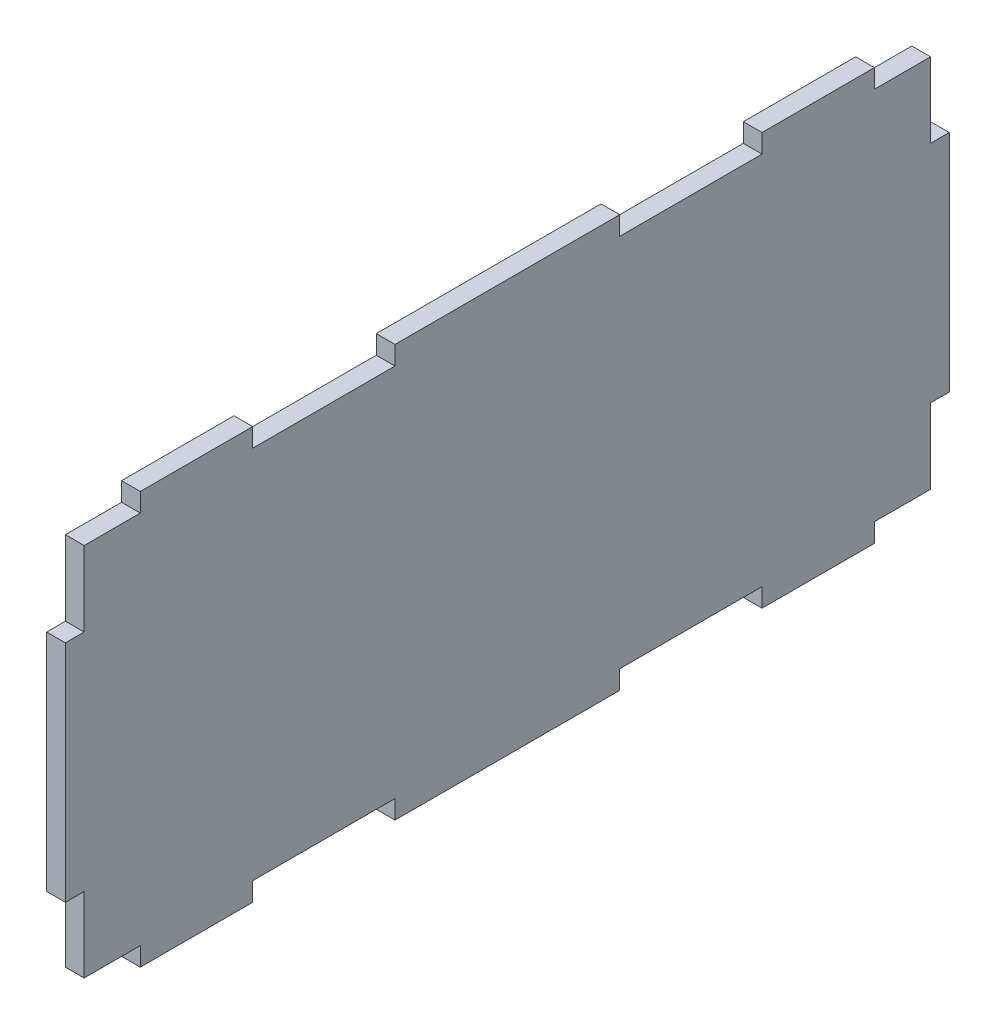
ISO-10303-21;
HEADER;
FILE_DESCRIPTION(('STEP AP214'),'2;1');
FILE_NAME('part.step','',(''),(''),'','','');
FILE_SCHEMA(('AUTOMOTIVE_DESIGN { 1 0 10303 214 1 1 1 1 }'));
ENDSEC;
DATA;
#1=APPLICATION_CONTEXT('core data for automotive mechanical design processes');
#2=APPLICATION_PROTOCOL_DEFINITION('international standard','automotive_design',2000,#1);
#3=PRODUCT_CONTEXT('',#1,'mechanical');
#4=PRODUCT('Part','Part','',(#3));
#5=PRODUCT_RELATED_PRODUCT_CATEGORY('part','',(#4));
#6=PRODUCT_DEFINITION_FORMATION('','',#4);
#7=PRODUCT_DEFINITION_CONTEXT('part definition',#1,'design');
#8=PRODUCT_DEFINITION('design','',#6,#7);
#9=PRODUCT_DEFINITION_SHAPE('','',#8);
#10=(LENGTH_UNIT() NAMED_UNIT(*) SI_UNIT(.MILLI.,.METRE.));
#11=(NAMED_UNIT(*) PLANE_ANGLE_UNIT() SI_UNIT($,.RADIAN.));
#12=(NAMED_UNIT(*) SI_UNIT($,.STERADIAN.) SOLID_ANGLE_UNIT());
#13=UNCERTAINTY_MEASURE_WITH_UNIT(LENGTH_MEASURE(1.E-05),#10,'distance_accuracy_value','');
#14=(GEOMETRIC_REPRESENTATION_CONTEXT(3) GLOBAL_UNCERTAINTY_ASSIGNED_CONTEXT((#13)) GLOBAL_UNIT_ASSIGNED_CONTEXT((#10,
#11,#12)) REPRESENTATION_CONTEXT('',''));
#15=CARTESIAN_POINT('',(0.,0.,0.));
#16=DIRECTION('',(0.,0.,1.));
#17=DIRECTION('',(1.,0.,0.));
#18=AXIS2_PLACEMENT_3D('',#15,#16,#17);
#19=CARTESIAN_POINT('',(5.,-50.,0.));
#20=DIRECTION('',(0.,-1.,0.));
#21=DIRECTION('',(0.,0.,-1.));
#22=AXIS2_PLACEMENT_3D('',#19,#20,#21);
#23=PLANE('',#22);
#24=DIRECTION('',(0.,0.,1.));
#25=VECTOR('',#24,1.);
#26=CARTESIAN_POINT('',(0.,-50.,0.));
#27=LINE('',#26,#25);
#28=CARTESIAN_POINT('',(0.,-50.,98.));
#29=VERTEX_POINT('',#28);
#30=CARTESIAN_POINT('',(0.,-50.,113.));
#31=VERTEX_POINT('',#30);
#32=EDGE_CURVE('E742',#29,#31,#27,.T.);
#33=ORIENTED_EDGE('',*,*,#32,.F.);
#34=DIRECTION('',(-1.,0.,0.));
#35=VECTOR('',#34,1.);
#36=CARTESIAN_POINT('',(5.,-50.,98.));
#37=LINE('',#36,#35);
#38=CARTESIAN_POINT('',(5.,-50.,98.));
#39=VERTEX_POINT('',#38);
#40=EDGE_CURVE('E582',#39,#29,#37,.T.);
#41=ORIENTED_EDGE('',*,*,#40,.F.);
#42=DIRECTION('',(0.,0.,1.));
#43=VECTOR('',#42,1.);
#44=CARTESIAN_POINT('',(5.,-50.,0.));
#45=LINE('',#44,#43);
#46=CARTESIAN_POINT('',(5.,-50.,113.));
#47=VERTEX_POINT('',#46);
#48=EDGE_CURVE('E585',#39,#47,#45,.T.);
#49=ORIENTED_EDGE('',*,*,#48,.T.);
#50=DIRECTION('',(-1.,0.,0.));
#51=VECTOR('',#50,1.);
#52=CARTESIAN_POINT('',(5.,-50.,113.));
#53=LINE('',#52,#51);
#54=EDGE_CURVE('E573',#47,#31,#53,.T.);
#55=ORIENTED_EDGE('',*,*,#54,.T.);
#56=EDGE_LOOP('',(#33,#41,#49,#55));
#57=FACE_BOUND('',#56,.T.);
#58=ADVANCED_FACE('F252',(#57),#23,.T.);
#59=CARTESIAN_POINT('',(5.,0.,98.));
#60=DIRECTION('',(0.,0.,-1.));
#61=DIRECTION('',(-1.,0.,0.));
#62=AXIS2_PLACEMENT_3D('',#59,#60,#61);
#63=PLANE('',#62);
#64=DIRECTION('',(0.,-1.,0.));
#65=VECTOR('',#64,1.);
#66=CARTESIAN_POINT('',(0.,0.,98.));
#67=LINE('',#66,#65);
#68=CARTESIAN_POINT('',(0.,-55.,98.));
#69=VERTEX_POINT('',#68);
#70=EDGE_CURVE('E740',#29,#69,#67,.T.);
#71=ORIENTED_EDGE('',*,*,#70,.T.);
#72=DIRECTION('',(-1.,0.,0.));
#73=VECTOR('',#72,1.);
#74=CARTESIAN_POINT('',(5.,-55.,98.));
#75=LINE('',#74,#73);
#76=CARTESIAN_POINT('',(5.,-55.,98.));
#77=VERTEX_POINT('',#76);
#78=EDGE_CURVE('E657',#77,#69,#75,.T.);
#79=ORIENTED_EDGE('',*,*,#78,.F.);
#80=DIRECTION('',(0.,-1.,0.));
#81=VECTOR('',#80,1.);
#82=CARTESIAN_POINT('',(5.,0.,98.));
#83=LINE('',#82,#81);
#84=EDGE_CURVE('E593',#39,#77,#83,.T.);
#85=ORIENTED_EDGE('',*,*,#84,.F.);
#86=ORIENTED_EDGE('',*,*,#40,.T.);
#87=EDGE_LOOP('',(#71,#79,#85,#86));
#88=FACE_BOUND('',#87,.T.);
#89=ADVANCED_FACE('F796',(#88),#63,.F.);
#90=CARTESIAN_POINT('',(5.,-55.0000000000002,1.1449174941447E-13));
#91=DIRECTION('',(0.,1.,0.));
#92=DIRECTION('',(0.,0.,1.));
#93=AXIS2_PLACEMENT_3D('',#90,#91,#92);
#94=PLANE('',#93);
#95=DIRECTION('',(0.,0.,-1.));
#96=VECTOR('',#95,1.);
#97=CARTESIAN_POINT('',(0.,-55.0000000000002,1.1449174941447E-13));
#98=LINE('',#97,#96);
#99=CARTESIAN_POINT('',(0.,-55.,68.));
#100=VERTEX_POINT('',#99);
#101=EDGE_CURVE('E737',#69,#100,#98,.T.);
#102=ORIENTED_EDGE('',*,*,#101,.T.);
#103=DIRECTION('',(-1.,0.,0.));
#104=VECTOR('',#103,1.);
#105=CARTESIAN_POINT('',(5.,-55.,68.));
#106=LINE('',#105,#104);
#107=CARTESIAN_POINT('',(5.,-55.,68.));
#108=VERTEX_POINT('',#107);
#109=EDGE_CURVE('E660',#108,#100,#106,.T.);
#110=ORIENTED_EDGE('',*,*,#109,.F.);
#111=DIRECTION('',(0.,0.,-1.));
#112=VECTOR('',#111,1.);
#113=CARTESIAN_POINT('',(5.,-55.0000000000002,1.1449174941447E-13));
#114=LINE('',#113,#112);
#115=EDGE_CURVE('E597',#77,#108,#114,.T.);
#116=ORIENTED_EDGE('',*,*,#115,.F.);
#117=ORIENTED_EDGE('',*,*,#78,.T.);
#118=EDGE_LOOP('',(#102,#110,#116,#117));
#119=FACE_BOUND('',#118,.T.);
#120=ADVANCED_FACE('F779',(#119),#94,.F.);
#121=CARTESIAN_POINT('',(5.,0.,68.));
#122=DIRECTION('',(0.,0.,-1.));
#123=DIRECTION('',(-1.,0.,0.));
#124=AXIS2_PLACEMENT_3D('',#121,#122,#123);
#125=PLANE('',#124);
#126=DIRECTION('',(0.,-1.,0.));
#127=VECTOR('',#126,1.);
#128=CARTESIAN_POINT('',(0.,0.,68.));
#129=LINE('',#128,#127);
#130=CARTESIAN_POINT('',(0.,-50.,68.));
#131=VERTEX_POINT('',#130);
#132=EDGE_CURVE('E733',#131,#100,#129,.T.);
#133=ORIENTED_EDGE('',*,*,#132,.F.);
#134=DIRECTION('',(-1.,0.,0.));
#135=VECTOR('',#134,1.);
#136=CARTESIAN_POINT('',(5.,-50.,68.));
#137=LINE('',#136,#135);
#138=CARTESIAN_POINT('',(5.,-50.,68.));
#139=VERTEX_POINT('',#138);
#140=EDGE_CURVE('E662',#139,#131,#137,.T.);
#141=ORIENTED_EDGE('',*,*,#140,.F.);
#142=DIRECTION('',(0.,-1.,0.));
#143=VECTOR('',#142,1.);
#144=CARTESIAN_POINT('',(5.,0.,68.));
#145=LINE('',#144,#143);
#146=EDGE_CURVE('E600',#139,#108,#145,.T.);
#147=ORIENTED_EDGE('',*,*,#146,.T.);
#148=ORIENTED_EDGE('',*,*,#109,.T.);
#149=EDGE_LOOP('',(#133,#141,#147,#148));
#150=FACE_BOUND('',#149,.T.);
#151=ADVANCED_FACE('F784',(#150),#125,.T.);
#152=DIRECTION('',(-1.,0.,0.));
#153=VECTOR('',#152,1.);
#154=CARTESIAN_POINT('',(5.,-49.9999999999999,30.));
#155=LINE('',#154,#153);
#156=CARTESIAN_POINT('',(5.,-50.,30.));
#157=VERTEX_POINT('',#156);
#158=CARTESIAN_POINT('',(0.,-50.,30.));
#159=VERTEX_POINT('',#158);
#160=EDGE_CURVE('E360',#157,#159,#155,.T.);
#161=ORIENTED_EDGE('',*,*,#160,.F.);
#162=EDGE_CURVE('E595',#157,#139,#45,.T.);
#163=ORIENTED_EDGE('',*,*,#162,.T.);
#164=ORIENTED_EDGE('',*,*,#140,.T.);
#165=EDGE_CURVE('E736',#159,#131,#27,.T.);
#166=ORIENTED_EDGE('',*,*,#165,.F.);
#167=EDGE_LOOP('',(#161,#163,#164,#166));
#168=FACE_BOUND('',#167,.T.);
#169=ADVANCED_FACE('F787',(#168),#23,.T.);
#170=CARTESIAN_POINT('',(5.,-50.,-68.));
#171=VERTEX_POINT('',#170);
#172=CARTESIAN_POINT('',(5.,-50.,-30.));
#173=VERTEX_POINT('',#172);
#174=EDGE_CURVE('E599',#171,#173,#45,.T.);
#175=ORIENTED_EDGE('',*,*,#174,.T.);
#176=DIRECTION('',(-1.,0.,0.));
#177=VECTOR('',#176,1.);
#178=CARTESIAN_POINT('',(5.,-49.9999999999999,-30.));
#179=LINE('',#178,#177);
#180=CARTESIAN_POINT('',(0.,-50.,-30.));
#181=VERTEX_POINT('',#180);
#182=EDGE_CURVE('E367',#173,#181,#179,.T.);
#183=ORIENTED_EDGE('',*,*,#182,.T.);
#184=CARTESIAN_POINT('',(0.,-50.,-68.));
#185=VERTEX_POINT('',#184);
#186=EDGE_CURVE('E792',#185,#181,#27,.T.);
#187=ORIENTED_EDGE('',*,*,#186,.F.);
#188=DIRECTION('',(1.,0.,0.));
#189=VECTOR('',#188,1.);
#190=CARTESIAN_POINT('',(5.,-50.,-68.));
#191=LINE('',#190,#189);
#192=EDGE_CURVE('E408',#185,#171,#191,.T.);
#193=ORIENTED_EDGE('',*,*,#192,.T.);
#194=EDGE_LOOP('',(#175,#183,#187,#193));
#195=FACE_BOUND('',#194,.T.);
#196=ADVANCED_FACE('F608',(#195),#23,.T.);
#197=CARTESIAN_POINT('',(5.,-50.,-113.));
#198=VERTEX_POINT('',#197);
#199=CARTESIAN_POINT('',(5.,-50.,-98.));
#200=VERTEX_POINT('',#199);
#201=EDGE_CURVE('E596',#198,#200,#45,.T.);
#202=ORIENTED_EDGE('',*,*,#201,.T.);
#203=DIRECTION('',(-1.,0.,0.));
#204=VECTOR('',#203,1.);
#205=CARTESIAN_POINT('',(5.,-49.9999999999999,-98.));
#206=LINE('',#205,#204);
#207=CARTESIAN_POINT('',(0.,-50.,-98.));
#208=VERTEX_POINT('',#207);
#209=EDGE_CURVE('E376',#200,#208,#206,.T.);
#210=ORIENTED_EDGE('',*,*,#209,.T.);
#211=CARTESIAN_POINT('',(0.,-50.,-113.));
#212=VERTEX_POINT('',#211);
#213=EDGE_CURVE('E744',#212,#208,#27,.T.);
#214=ORIENTED_EDGE('',*,*,#213,.F.);
#215=DIRECTION('',(-1.,0.,0.));
#216=VECTOR('',#215,1.);
#217=CARTESIAN_POINT('',(5.,-50.,-113.));
#218=LINE('',#217,#216);
#219=EDGE_CURVE('E665',#198,#212,#218,.T.);
#220=ORIENTED_EDGE('',*,*,#219,.F.);
#221=EDGE_LOOP('',(#202,#210,#214,#220));
#222=FACE_BOUND('',#221,.T.);
#223=ADVANCED_FACE('F938',(#222),#23,.T.);
#224=CARTESIAN_POINT('',(5.,0.,-113.));
#225=DIRECTION('',(0.,0.,1.));
#226=DIRECTION('',(1.,0.,0.));
#227=AXIS2_PLACEMENT_3D('',#224,#225,#226);
#228=PLANE('',#227);
#229=DIRECTION('',(-1.,0.,0.));
#230=VECTOR('',#229,1.);
#231=CARTESIAN_POINT('',(5.,-30.,-113.));
#232=LINE('',#231,#230);
#233=CARTESIAN_POINT('',(5.,-30.,-113.));
#234=VERTEX_POINT('',#233);
#235=CARTESIAN_POINT('',(0.,-30.,-113.));
#236=VERTEX_POINT('',#235);
#237=EDGE_CURVE('E12',#234,#236,#232,.T.);
#238=ORIENTED_EDGE('',*,*,#237,.F.);
#239=DIRECTION('',(0.,1.,0.));
#240=VECTOR('',#239,1.);
#241=CARTESIAN_POINT('',(5.,0.,-113.));
#242=LINE('',#241,#240);
#243=EDGE_CURVE('E423',#198,#234,#242,.T.);
#244=ORIENTED_EDGE('',*,*,#243,.F.);
#245=ORIENTED_EDGE('',*,*,#219,.T.);
#246=DIRECTION('',(0.,1.,0.));
#247=VECTOR('',#246,1.);
#248=CARTESIAN_POINT('',(0.,0.,-113.));
#249=LINE('',#248,#247);
#250=EDGE_CURVE('E730',#212,#236,#249,.T.);
#251=ORIENTED_EDGE('',*,*,#250,.T.);
#252=EDGE_LOOP('',(#238,#244,#245,#251));
#253=FACE_BOUND('',#252,.T.);
#254=ADVANCED_FACE('F933',(#253),#228,.F.);
#255=CARTESIAN_POINT('',(5.,30.,-113.));
#256=VERTEX_POINT('',#255);
#257=CARTESIAN_POINT('',(5.,50.,-113.));
#258=VERTEX_POINT('',#257);
#259=EDGE_CURVE('E602',#256,#258,#242,.T.);
#260=ORIENTED_EDGE('',*,*,#259,.F.);
#261=DIRECTION('',(-1.,0.,0.));
#262=VECTOR('',#261,1.);
#263=CARTESIAN_POINT('',(5.,30.,-113.));
#264=LINE('',#263,#262);
#265=CARTESIAN_POINT('',(0.,30.,-113.));
#266=VERTEX_POINT('',#265);
#267=EDGE_CURVE('E262',#256,#266,#264,.T.);
#268=ORIENTED_EDGE('',*,*,#267,.T.);
#269=CARTESIAN_POINT('',(0.,50.,-113.));
#270=VERTEX_POINT('',#269);
#271=EDGE_CURVE('E732',#266,#270,#249,.T.);
#272=ORIENTED_EDGE('',*,*,#271,.T.);
#273=DIRECTION('',(-1.,0.,0.));
#274=VECTOR('',#273,1.);
#275=CARTESIAN_POINT('',(5.,50.,-113.));
#276=LINE('',#275,#274);
#277=EDGE_CURVE('E667',#258,#270,#276,.T.);
#278=ORIENTED_EDGE('',*,*,#277,.F.);
#279=EDGE_LOOP('',(#260,#268,#272,#278));
#280=FACE_BOUND('',#279,.T.);
#281=ADVANCED_FACE('F846',(#280),#228,.F.);
#282=CARTESIAN_POINT('',(5.,50.,0.));
#283=DIRECTION('',(0.,-1.,0.));
#284=DIRECTION('',(0.,0.,-1.));
#285=AXIS2_PLACEMENT_3D('',#282,#283,#284);
#286=PLANE('',#285);
#287=DIRECTION('',(0.,0.,1.));
#288=VECTOR('',#287,1.);
#289=CARTESIAN_POINT('',(0.,50.,0.));
#290=LINE('',#289,#288);
#291=CARTESIAN_POINT('',(0.,50.,-98.));
#292=VERTEX_POINT('',#291);
#293=EDGE_CURVE('E728',#270,#292,#290,.T.);
#294=ORIENTED_EDGE('',*,*,#293,.T.);
#295=DIRECTION('',(-1.,0.,0.));
#296=VECTOR('',#295,1.);
#297=CARTESIAN_POINT('',(5.,50.,-98.));
#298=LINE('',#297,#296);
#299=CARTESIAN_POINT('',(5.,50.,-98.));
#300=VERTEX_POINT('',#299);
#301=EDGE_CURVE('E670',#300,#292,#298,.T.);
#302=ORIENTED_EDGE('',*,*,#301,.F.);
#303=DIRECTION('',(0.,0.,1.));
#304=VECTOR('',#303,1.);
#305=CARTESIAN_POINT('',(5.,50.,0.));
#306=LINE('',#305,#304);
#307=EDGE_CURVE('E770',#258,#300,#306,.T.);
#308=ORIENTED_EDGE('',*,*,#307,.F.);
#309=ORIENTED_EDGE('',*,*,#277,.T.);
#310=EDGE_LOOP('',(#294,#302,#308,#309));
#311=FACE_BOUND('',#310,.T.);
#312=ADVANCED_FACE('F849',(#311),#286,.F.);
#313=CARTESIAN_POINT('',(5.,0.,-98.));
#314=DIRECTION('',(0.,0.,1.));
#315=DIRECTION('',(1.,0.,0.));
#316=AXIS2_PLACEMENT_3D('',#313,#314,#315);
#317=PLANE('',#316);
#318=DIRECTION('',(0.,1.,0.));
#319=VECTOR('',#318,1.);
#320=CARTESIAN_POINT('',(0.,0.,-98.));
#321=LINE('',#320,#319);
#322=CARTESIAN_POINT('',(0.,55.,-98.));
#323=VERTEX_POINT('',#322);
#324=EDGE_CURVE('E726',#292,#323,#321,.T.);
#325=ORIENTED_EDGE('',*,*,#324,.T.);
#326=DIRECTION('',(-1.,0.,0.));
#327=VECTOR('',#326,1.);
#328=CARTESIAN_POINT('',(5.,55.,-98.));
#329=LINE('',#328,#327);
#330=CARTESIAN_POINT('',(5.,55.,-98.));
#331=VERTEX_POINT('',#330);
#332=EDGE_CURVE('E673',#331,#323,#329,.T.);
#333=ORIENTED_EDGE('',*,*,#332,.F.);
#334=DIRECTION('',(0.,1.,0.));
#335=VECTOR('',#334,1.);
#336=CARTESIAN_POINT('',(5.,0.,-98.));
#337=LINE('',#336,#335);
#338=EDGE_CURVE('E768',#300,#331,#337,.T.);
#339=ORIENTED_EDGE('',*,*,#338,.F.);
#340=ORIENTED_EDGE('',*,*,#301,.T.);
#341=EDGE_LOOP('',(#325,#333,#339,#340));
#342=FACE_BOUND('',#341,.T.);
#343=ADVANCED_FACE('F857',(#342),#317,.F.);
#344=CARTESIAN_POINT('',(5.,55.0000000000002,0.));
#345=DIRECTION('',(0.,-1.,0.));
#346=DIRECTION('',(0.,0.,-1.));
#347=AXIS2_PLACEMENT_3D('',#344,#345,#346);
#348=PLANE('',#347);
#349=DIRECTION('',(0.,0.,1.));
#350=VECTOR('',#349,1.);
#351=CARTESIAN_POINT('',(0.,55.0000000000002,0.));
#352=LINE('',#351,#350);
#353=CARTESIAN_POINT('',(0.,55.,-68.));
#354=VERTEX_POINT('',#353);
#355=EDGE_CURVE('E723',#323,#354,#352,.T.);
#356=ORIENTED_EDGE('',*,*,#355,.T.);
#357=DIRECTION('',(-1.,0.,0.));
#358=VECTOR('',#357,1.);
#359=CARTESIAN_POINT('',(5.,55.,-68.));
#360=LINE('',#359,#358);
#361=CARTESIAN_POINT('',(5.,55.,-68.));
#362=VERTEX_POINT('',#361);
#363=EDGE_CURVE('E676',#362,#354,#360,.T.);
#364=ORIENTED_EDGE('',*,*,#363,.F.);
#365=DIRECTION('',(0.,0.,1.));
#366=VECTOR('',#365,1.);
#367=CARTESIAN_POINT('',(5.,55.0000000000002,0.));
#368=LINE('',#367,#366);
#369=EDGE_CURVE('E766',#331,#362,#368,.T.);
#370=ORIENTED_EDGE('',*,*,#369,.F.);
#371=ORIENTED_EDGE('',*,*,#332,.T.);
#372=EDGE_LOOP('',(#356,#364,#370,#371));
#373=FACE_BOUND('',#372,.T.);
#374=ADVANCED_FACE('F860',(#373),#348,.F.);
#375=CARTESIAN_POINT('',(5.,0.,-68.));
#376=DIRECTION('',(0.,0.,1.));
#377=DIRECTION('',(1.,0.,0.));
#378=AXIS2_PLACEMENT_3D('',#375,#376,#377);
#379=PLANE('',#378);
#380=DIRECTION('',(0.,1.,0.));
#381=VECTOR('',#380,1.);
#382=CARTESIAN_POINT('',(0.,0.,-68.));
#383=LINE('',#382,#381);
#384=CARTESIAN_POINT('',(0.,50.,-68.));
#385=VERTEX_POINT('',#384);
#386=EDGE_CURVE('E719',#385,#354,#383,.T.);
#387=ORIENTED_EDGE('',*,*,#386,.F.);
#388=DIRECTION('',(-1.,0.,0.));
#389=VECTOR('',#388,1.);
#390=CARTESIAN_POINT('',(5.,50.,-68.));
#391=LINE('',#390,#389);
#392=CARTESIAN_POINT('',(5.,50.,-68.));
#393=VERTEX_POINT('',#392);
#394=EDGE_CURVE('E678',#393,#385,#391,.T.);
#395=ORIENTED_EDGE('',*,*,#394,.F.);
#396=DIRECTION('',(0.,1.,0.));
#397=VECTOR('',#396,1.);
#398=CARTESIAN_POINT('',(5.,0.,-68.));
#399=LINE('',#398,#397);
#400=EDGE_CURVE('E762',#393,#362,#399,.T.);
#401=ORIENTED_EDGE('',*,*,#400,.T.);
#402=ORIENTED_EDGE('',*,*,#363,.T.);
#403=EDGE_LOOP('',(#387,#395,#401,#402));
#404=FACE_BOUND('',#403,.T.);
#405=ADVANCED_FACE('F863',(#404),#379,.T.);
#406=DIRECTION('',(-1.,0.,0.));
#407=VECTOR('',#406,1.);
#408=CARTESIAN_POINT('',(5.,49.9999999999999,-30.));
#409=LINE('',#408,#407);
#410=CARTESIAN_POINT('',(5.,50.,-30.));
#411=VERTEX_POINT('',#410);
#412=CARTESIAN_POINT('',(0.,50.,-30.));
#413=VERTEX_POINT('',#412);
#414=EDGE_CURVE('E639',#411,#413,#409,.T.);
#415=ORIENTED_EDGE('',*,*,#414,.F.);
#416=EDGE_CURVE('E761',#393,#411,#306,.T.);
#417=ORIENTED_EDGE('',*,*,#416,.F.);
#418=ORIENTED_EDGE('',*,*,#394,.T.);
#419=EDGE_CURVE('E718',#385,#413,#290,.T.);
#420=ORIENTED_EDGE('',*,*,#419,.T.);
#421=EDGE_LOOP('',(#415,#417,#418,#420));
#422=FACE_BOUND('',#421,.T.);
#423=ADVANCED_FACE('F914',(#422),#286,.F.);
#424=CARTESIAN_POINT('',(5.,50.,30.));
#425=VERTEX_POINT('',#424);
#426=CARTESIAN_POINT('',(5.,50.,68.));
#427=VERTEX_POINT('',#426);
#428=EDGE_CURVE('E765',#425,#427,#306,.T.);
#429=ORIENTED_EDGE('',*,*,#428,.F.);
#430=DIRECTION('',(-1.,0.,0.));
#431=VECTOR('',#430,1.);
#432=CARTESIAN_POINT('',(5.,49.9999999999999,30.));
#433=LINE('',#432,#431);
#434=CARTESIAN_POINT('',(0.,50.,30.));
#435=VERTEX_POINT('',#434);
#436=EDGE_CURVE('E271',#425,#435,#433,.T.);
#437=ORIENTED_EDGE('',*,*,#436,.T.);
#438=CARTESIAN_POINT('',(0.,50.,68.));
#439=VERTEX_POINT('',#438);
#440=EDGE_CURVE('E722',#435,#439,#290,.T.);
#441=ORIENTED_EDGE('',*,*,#440,.T.);
#442=DIRECTION('',(-1.,0.,0.));
#443=VECTOR('',#442,1.);
#444=CARTESIAN_POINT('',(5.,50.,68.));
#445=LINE('',#444,#443);
#446=EDGE_CURVE('E680',#427,#439,#445,.T.);
#447=ORIENTED_EDGE('',*,*,#446,.F.);
#448=EDGE_LOOP('',(#429,#437,#441,#447));
#449=FACE_BOUND('',#448,.T.);
#450=ADVANCED_FACE('F898',(#449),#286,.F.);
#451=CARTESIAN_POINT('',(5.,0.,68.));
#452=DIRECTION('',(0.,0.,1.));
#453=DIRECTION('',(1.,0.,0.));
#454=AXIS2_PLACEMENT_3D('',#451,#452,#453);
#455=PLANE('',#454);
#456=DIRECTION('',(0.,1.,0.));
#457=VECTOR('',#456,1.);
#458=CARTESIAN_POINT('',(0.,0.,68.));
#459=LINE('',#458,#457);
#460=CARTESIAN_POINT('',(0.,55.,68.));
#461=VERTEX_POINT('',#460);
#462=EDGE_CURVE('E715',#439,#461,#459,.T.);
#463=ORIENTED_EDGE('',*,*,#462,.T.);
#464=DIRECTION('',(-1.,0.,0.));
#465=VECTOR('',#464,1.);
#466=CARTESIAN_POINT('',(5.,55.,68.));
#467=LINE('',#466,#465);
#468=CARTESIAN_POINT('',(5.,55.,68.));
#469=VERTEX_POINT('',#468);
#470=EDGE_CURVE('E683',#469,#461,#467,.T.);
#471=ORIENTED_EDGE('',*,*,#470,.F.);
#472=DIRECTION('',(0.,1.,0.));
#473=VECTOR('',#472,1.);
#474=CARTESIAN_POINT('',(5.,0.,68.));
#475=LINE('',#474,#473);
#476=EDGE_CURVE('E759',#427,#469,#475,.T.);
#477=ORIENTED_EDGE('',*,*,#476,.F.);
#478=ORIENTED_EDGE('',*,*,#446,.T.);
#479=EDGE_LOOP('',(#463,#471,#477,#478));
#480=FACE_BOUND('',#479,.T.);
#481=ADVANCED_FACE('F902',(#480),#455,.F.);
#482=CARTESIAN_POINT('',(5.,55.0000000000002,0.));
#483=DIRECTION('',(0.,1.,0.));
#484=DIRECTION('',(0.,0.,1.));
#485=AXIS2_PLACEMENT_3D('',#482,#483,#484);
#486=PLANE('',#485);
#487=DIRECTION('',(0.,0.,-1.));
#488=VECTOR('',#487,1.);
#489=CARTESIAN_POINT('',(0.,55.0000000000002,0.));
#490=LINE('',#489,#488);
#491=CARTESIAN_POINT('',(0.,55.,98.));
#492=VERTEX_POINT('',#491);
#493=EDGE_CURVE('E712',#492,#461,#490,.T.);
#494=ORIENTED_EDGE('',*,*,#493,.F.);
#495=DIRECTION('',(-1.,0.,0.));
#496=VECTOR('',#495,1.);
#497=CARTESIAN_POINT('',(5.,55.,98.));
#498=LINE('',#497,#496);
#499=CARTESIAN_POINT('',(5.,55.,98.));
#500=VERTEX_POINT('',#499);
#501=EDGE_CURVE('E685',#500,#492,#498,.T.);
#502=ORIENTED_EDGE('',*,*,#501,.F.);
#503=DIRECTION('',(0.,0.,-1.));
#504=VECTOR('',#503,1.);
#505=CARTESIAN_POINT('',(5.,55.0000000000002,0.));
#506=LINE('',#505,#504);
#507=EDGE_CURVE('E756',#500,#469,#506,.T.);
#508=ORIENTED_EDGE('',*,*,#507,.T.);
#509=ORIENTED_EDGE('',*,*,#470,.T.);
#510=EDGE_LOOP('',(#494,#502,#508,#509));
#511=FACE_BOUND('',#510,.T.);
#512=ADVANCED_FACE('F907',(#511),#486,.T.);
#513=CARTESIAN_POINT('',(5.,0.,98.));
#514=DIRECTION('',(0.,0.,1.));
#515=DIRECTION('',(1.,0.,0.));
#516=AXIS2_PLACEMENT_3D('',#513,#514,#515);
#517=PLANE('',#516);
#518=DIRECTION('',(0.,1.,0.));
#519=VECTOR('',#518,1.);
#520=CARTESIAN_POINT('',(0.,0.,98.));
#521=LINE('',#520,#519);
#522=CARTESIAN_POINT('',(0.,50.,98.));
#523=VERTEX_POINT('',#522);
#524=EDGE_CURVE('E708',#523,#492,#521,.T.);
#525=ORIENTED_EDGE('',*,*,#524,.F.);
#526=DIRECTION('',(-1.,0.,0.));
#527=VECTOR('',#526,1.);
#528=CARTESIAN_POINT('',(5.,50.,98.));
#529=LINE('',#528,#527);
#530=CARTESIAN_POINT('',(5.,50.,98.));
#531=VERTEX_POINT('',#530);
#532=EDGE_CURVE('E687',#531,#523,#529,.T.);
#533=ORIENTED_EDGE('',*,*,#532,.F.);
#534=DIRECTION('',(0.,1.,0.));
#535=VECTOR('',#534,1.);
#536=CARTESIAN_POINT('',(5.,0.,98.));
#537=LINE('',#536,#535);
#538=EDGE_CURVE('E752',#531,#500,#537,.T.);
#539=ORIENTED_EDGE('',*,*,#538,.T.);
#540=ORIENTED_EDGE('',*,*,#501,.T.);
#541=EDGE_LOOP('',(#525,#533,#539,#540));
#542=FACE_BOUND('',#541,.T.);
#543=ADVANCED_FACE('F910',(#542),#517,.T.);
#544=CARTESIAN_POINT('',(0.,50.,113.));
#545=VERTEX_POINT('',#544);
#546=EDGE_CURVE('E711',#523,#545,#290,.T.);
#547=ORIENTED_EDGE('',*,*,#546,.T.);
#548=DIRECTION('',(-1.,0.,0.));
#549=VECTOR('',#548,1.);
#550=CARTESIAN_POINT('',(5.,50.,113.));
#551=LINE('',#550,#549);
#552=CARTESIAN_POINT('',(5.,50.,113.));
#553=VERTEX_POINT('',#552);
#554=EDGE_CURVE('E689',#553,#545,#551,.T.);
#555=ORIENTED_EDGE('',*,*,#554,.F.);
#556=EDGE_CURVE('E755',#531,#553,#306,.T.);
#557=ORIENTED_EDGE('',*,*,#556,.F.);
#558=ORIENTED_EDGE('',*,*,#532,.T.);
#559=EDGE_LOOP('',(#547,#555,#557,#558));
#560=FACE_BOUND('',#559,.T.);
#561=ADVANCED_FACE('F911',(#560),#286,.F.);
#562=CARTESIAN_POINT('',(5.,0.,113.));
#563=DIRECTION('',(0.,0.,1.));
#564=DIRECTION('',(1.,0.,0.));
#565=AXIS2_PLACEMENT_3D('',#562,#563,#564);
#566=PLANE('',#565);
#567=DIRECTION('',(0.,1.,0.));
#568=VECTOR('',#567,1.);
#569=CARTESIAN_POINT('',(0.,0.,113.));
#570=LINE('',#569,#568);
#571=CARTESIAN_POINT('',(0.,30.,113.));
#572=VERTEX_POINT('',#571);
#573=EDGE_CURVE('E707',#572,#545,#570,.T.);
#574=ORIENTED_EDGE('',*,*,#573,.F.);
#575=DIRECTION('',(-1.,0.,0.));
#576=VECTOR('',#575,1.);
#577=CARTESIAN_POINT('',(5.,30.,113.));
#578=LINE('',#577,#576);
#579=CARTESIAN_POINT('',(5.,30.,113.));
#580=VERTEX_POINT('',#579);
#581=EDGE_CURVE('E691',#580,#572,#578,.T.);
#582=ORIENTED_EDGE('',*,*,#581,.F.);
#583=DIRECTION('',(0.,1.,0.));
#584=VECTOR('',#583,1.);
#585=CARTESIAN_POINT('',(5.,0.,113.));
#586=LINE('',#585,#584);
#587=EDGE_CURVE('E591',#580,#553,#586,.T.);
#588=ORIENTED_EDGE('',*,*,#587,.T.);
#589=ORIENTED_EDGE('',*,*,#554,.T.);
#590=EDGE_LOOP('',(#574,#582,#588,#589));
#591=FACE_BOUND('',#590,.T.);
#592=ADVANCED_FACE('F877',(#591),#566,.T.);
#593=CARTESIAN_POINT('',(5.,30.,0.));
#594=DIRECTION('',(0.,-1.,0.));
#595=DIRECTION('',(0.,0.,-1.));
#596=AXIS2_PLACEMENT_3D('',#593,#594,#595);
#597=PLANE('',#596);
#598=DIRECTION('',(0.,0.,1.));
#599=VECTOR('',#598,1.);
#600=CARTESIAN_POINT('',(0.,30.,0.));
#601=LINE('',#600,#599);
#602=CARTESIAN_POINT('',(0.,30.,118.));
#603=VERTEX_POINT('',#602);
#604=EDGE_CURVE('E704',#572,#603,#601,.T.);
#605=ORIENTED_EDGE('',*,*,#604,.T.);
#606=DIRECTION('',(-1.,0.,0.));
#607=VECTOR('',#606,1.);
#608=CARTESIAN_POINT('',(5.,30.,118.));
#609=LINE('',#608,#607);
#610=CARTESIAN_POINT('',(5.,30.,118.));
#611=VERTEX_POINT('',#610);
#612=EDGE_CURVE('E693',#611,#603,#609,.T.);
#613=ORIENTED_EDGE('',*,*,#612,.F.);
#614=DIRECTION('',(0.,0.,1.));
#615=VECTOR('',#614,1.);
#616=CARTESIAN_POINT('',(5.,30.,0.));
#617=LINE('',#616,#615);
#618=EDGE_CURVE('E750',#580,#611,#617,.T.);
#619=ORIENTED_EDGE('',*,*,#618,.F.);
#620=ORIENTED_EDGE('',*,*,#581,.T.);
#621=EDGE_LOOP('',(#605,#613,#619,#620));
#622=FACE_BOUND('',#621,.T.);
#623=ADVANCED_FACE('F882',(#622),#597,.F.);
#624=CARTESIAN_POINT('',(5.,0.,118.));
#625=DIRECTION('',(0.,0.,1.));
#626=DIRECTION('',(1.,0.,0.));
#627=AXIS2_PLACEMENT_3D('',#624,#625,#626);
#628=PLANE('',#627);
#629=DIRECTION('',(0.,1.,0.));
#630=VECTOR('',#629,1.);
#631=CARTESIAN_POINT('',(0.,0.,118.));
#632=LINE('',#631,#630);
#633=CARTESIAN_POINT('',(0.,-30.,118.));
#634=VERTEX_POINT('',#633);
#635=EDGE_CURVE('E701',#634,#603,#632,.T.);
#636=ORIENTED_EDGE('',*,*,#635,.F.);
#637=DIRECTION('',(-1.,0.,0.));
#638=VECTOR('',#637,1.);
#639=CARTESIAN_POINT('',(5.,-30.,118.));
#640=LINE('',#639,#638);
#641=CARTESIAN_POINT('',(5.,-30.,118.));
#642=VERTEX_POINT('',#641);
#643=EDGE_CURVE('E695',#642,#634,#640,.T.);
#644=ORIENTED_EDGE('',*,*,#643,.F.);
#645=DIRECTION('',(0.,1.,0.));
#646=VECTOR('',#645,1.);
#647=CARTESIAN_POINT('',(5.,0.,118.));
#648=LINE('',#647,#646);
#649=EDGE_CURVE('E747',#642,#611,#648,.T.);
#650=ORIENTED_EDGE('',*,*,#649,.T.);
#651=ORIENTED_EDGE('',*,*,#612,.T.);
#652=EDGE_LOOP('',(#636,#644,#650,#651));
#653=FACE_BOUND('',#652,.T.);
#654=ADVANCED_FACE('F886',(#653),#628,.T.);
#655=CARTESIAN_POINT('',(5.,-30.,0.));
#656=DIRECTION('',(0.,-1.,0.));
#657=DIRECTION('',(0.,0.,-1.));
#658=AXIS2_PLACEMENT_3D('',#655,#656,#657);
#659=PLANE('',#658);
#660=DIRECTION('',(0.,0.,1.));
#661=VECTOR('',#660,1.);
#662=CARTESIAN_POINT('',(0.,-30.,0.));
#663=LINE('',#662,#661);
#664=CARTESIAN_POINT('',(0.,-30.,113.));
#665=VERTEX_POINT('',#664);
#666=EDGE_CURVE('E589',#665,#634,#663,.T.);
#667=ORIENTED_EDGE('',*,*,#666,.F.);
#668=DIRECTION('',(-1.,0.,0.));
#669=VECTOR('',#668,1.);
#670=CARTESIAN_POINT('',(5.,-30.,113.));
#671=LINE('',#670,#669);
#672=CARTESIAN_POINT('',(5.,-30.,113.));
#673=VERTEX_POINT('',#672);
#674=EDGE_CURVE('E697',#673,#665,#671,.T.);
#675=ORIENTED_EDGE('',*,*,#674,.F.);
#676=DIRECTION('',(0.,0.,1.));
#677=VECTOR('',#676,1.);
#678=CARTESIAN_POINT('',(5.,-30.,0.));
#679=LINE('',#678,#677);
#680=EDGE_CURVE('E588',#673,#642,#679,.T.);
#681=ORIENTED_EDGE('',*,*,#680,.T.);
#682=ORIENTED_EDGE('',*,*,#643,.T.);
#683=EDGE_LOOP('',(#667,#675,#681,#682));
#684=FACE_BOUND('',#683,.T.);
#685=ADVANCED_FACE('F889',(#684),#659,.T.);
#686=EDGE_CURVE('E577',#31,#665,#570,.T.);
#687=ORIENTED_EDGE('',*,*,#686,.F.);
#688=ORIENTED_EDGE('',*,*,#54,.F.);
#689=EDGE_CURVE('E575',#47,#673,#586,.T.);
#690=ORIENTED_EDGE('',*,*,#689,.T.);
#691=ORIENTED_EDGE('',*,*,#674,.T.);
#692=EDGE_LOOP('',(#687,#688,#690,#691));
#693=FACE_BOUND('',#692,.T.);
#694=ADVANCED_FACE('F574',(#693),#566,.T.);
#695=CARTESIAN_POINT('',(0.,0.,0.));
#696=DIRECTION('',(1.,0.,0.));
#697=DIRECTION('',(0.,0.,-1.));
#698=AXIS2_PLACEMENT_3D('',#695,#696,#697);
#699=PLANE('',#698);
#700=ORIENTED_EDGE('',*,*,#686,.T.);
#701=ORIENTED_EDGE('',*,*,#666,.T.);
#702=ORIENTED_EDGE('',*,*,#635,.T.);
#703=ORIENTED_EDGE('',*,*,#604,.F.);
#704=ORIENTED_EDGE('',*,*,#573,.T.);
#705=ORIENTED_EDGE('',*,*,#546,.F.);
#706=ORIENTED_EDGE('',*,*,#524,.T.);
#707=ORIENTED_EDGE('',*,*,#493,.T.);
#708=ORIENTED_EDGE('',*,*,#462,.F.);
#709=ORIENTED_EDGE('',*,*,#440,.F.);
#710=DIRECTION('',(0.,1.,0.));
#711=VECTOR('',#710,1.);
#712=CARTESIAN_POINT('',(0.,49.9999999999999,30.));
#713=LINE('',#712,#711);
#714=CARTESIAN_POINT('',(0.,55.,30.));
#715=VERTEX_POINT('',#714);
#716=EDGE_CURVE('E641',#435,#715,#713,.T.);
#717=ORIENTED_EDGE('',*,*,#716,.T.);
#718=DIRECTION('',(0.,0.,-1.));
#719=VECTOR('',#718,1.);
#720=CARTESIAN_POINT('',(0.,55.,30.));
#721=LINE('',#720,#719);
#722=CARTESIAN_POINT('',(0.,55.,-30.));
#723=VERTEX_POINT('',#722);
#724=EDGE_CURVE('E645',#715,#723,#721,.T.);
#725=ORIENTED_EDGE('',*,*,#724,.T.);
#726=DIRECTION('',(0.,1.,0.));
#727=VECTOR('',#726,1.);
#728=CARTESIAN_POINT('',(0.,49.9999999999999,-30.));
#729=LINE('',#728,#727);
#730=EDGE_CURVE('E388',#413,#723,#729,.T.);
#731=ORIENTED_EDGE('',*,*,#730,.F.);
#732=ORIENTED_EDGE('',*,*,#419,.F.);
#733=ORIENTED_EDGE('',*,*,#386,.T.);
#734=ORIENTED_EDGE('',*,*,#355,.F.);
#735=ORIENTED_EDGE('',*,*,#324,.F.);
#736=ORIENTED_EDGE('',*,*,#293,.F.);
#737=ORIENTED_EDGE('',*,*,#271,.F.);
#738=DIRECTION('',(0.,0.,-1.));
#739=VECTOR('',#738,1.);
#740=CARTESIAN_POINT('',(0.,30.,-113.));
#741=LINE('',#740,#739);
#742=CARTESIAN_POINT('',(0.,30.,-118.));
#743=VERTEX_POINT('',#742);
#744=EDGE_CURVE('E354',#266,#743,#741,.T.);
#745=ORIENTED_EDGE('',*,*,#744,.T.);
#746=DIRECTION('',(0.,1.,0.));
#747=VECTOR('',#746,1.);
#748=CARTESIAN_POINT('',(0.,-30.,-118.));
#749=LINE('',#748,#747);
#750=CARTESIAN_POINT('',(0.,-30.,-118.));
#751=VERTEX_POINT('',#750);
#752=EDGE_CURVE('E344',#751,#743,#749,.T.);
#753=ORIENTED_EDGE('',*,*,#752,.F.);
#754=DIRECTION('',(0.,0.,-1.));
#755=VECTOR('',#754,1.);
#756=CARTESIAN_POINT('',(0.,-30.,-113.));
#757=LINE('',#756,#755);
#758=EDGE_CURVE('E331',#236,#751,#757,.T.);
#759=ORIENTED_EDGE('',*,*,#758,.F.);
#760=ORIENTED_EDGE('',*,*,#250,.F.);
#761=ORIENTED_EDGE('',*,*,#213,.T.);
#762=DIRECTION('',(0.,-1.,0.));
#763=VECTOR('',#762,1.);
#764=CARTESIAN_POINT('',(0.,-49.9999999999999,-98.));
#765=LINE('',#764,#763);
#766=CARTESIAN_POINT('',(0.,-55.,-98.));
#767=VERTEX_POINT('',#766);
#768=EDGE_CURVE('E350',#208,#767,#765,.T.);
#769=ORIENTED_EDGE('',*,*,#768,.T.);
#770=DIRECTION('',(0.,0.,1.));
#771=VECTOR('',#770,1.);
#772=CARTESIAN_POINT('',(0.,-55.,-98.));
#773=LINE('',#772,#771);
#774=CARTESIAN_POINT('',(0.,-55.,-68.));
#775=VERTEX_POINT('',#774);
#776=EDGE_CURVE('E401',#767,#775,#773,.T.);
#777=ORIENTED_EDGE('',*,*,#776,.T.);
#778=DIRECTION('',(0.,-1.,0.));
#779=VECTOR('',#778,1.);
#780=CARTESIAN_POINT('',(0.,-49.9999999999999,-68.));
#781=LINE('',#780,#779);
#782=EDGE_CURVE('E393',#185,#775,#781,.T.);
#783=ORIENTED_EDGE('',*,*,#782,.F.);
#784=ORIENTED_EDGE('',*,*,#186,.T.);
#785=DIRECTION('',(0.,-1.,0.));
#786=VECTOR('',#785,1.);
#787=CARTESIAN_POINT('',(0.,-49.9999999999999,-30.));
#788=LINE('',#787,#786);
#789=CARTESIAN_POINT('',(0.,-55.,-30.));
#790=VERTEX_POINT('',#789);
#791=EDGE_CURVE('E379',#181,#790,#788,.T.);
#792=ORIENTED_EDGE('',*,*,#791,.T.);
#793=DIRECTION('',(0.,0.,-1.));
#794=VECTOR('',#793,1.);
#795=CARTESIAN_POINT('',(0.,-55.,30.));
#796=LINE('',#795,#794);
#797=CARTESIAN_POINT('',(0.,-55.,30.));
#798=VERTEX_POINT('',#797);
#799=EDGE_CURVE('E625',#798,#790,#796,.T.);
#800=ORIENTED_EDGE('',*,*,#799,.F.);
#801=DIRECTION('',(0.,-1.,0.));
#802=VECTOR('',#801,1.);
#803=CARTESIAN_POINT('',(0.,-49.9999999999999,30.));
#804=LINE('',#803,#802);
#805=EDGE_CURVE('E411',#159,#798,#804,.T.);
#806=ORIENTED_EDGE('',*,*,#805,.F.);
#807=ORIENTED_EDGE('',*,*,#165,.T.);
#808=ORIENTED_EDGE('',*,*,#132,.T.);
#809=ORIENTED_EDGE('',*,*,#101,.F.);
#810=ORIENTED_EDGE('',*,*,#70,.F.);
#811=ORIENTED_EDGE('',*,*,#32,.T.);
#812=EDGE_LOOP('',(#700,#701,#702,#703,#704,#705,#706,#707,#708,#709,#717,#725,#731,#732,#733,
#734,#735,#736,#737,#745,#753,#759,#760,#761,#769,#777,#783,#784,#792,#800,#806,#807,#808,#809,
#810,#811));
#813=FACE_BOUND('',#812,.T.);
#814=ADVANCED_FACE('F352',(#813),#699,.F.);
#815=CARTESIAN_POINT('',(5.,0.,0.));
#816=DIRECTION('',(1.,0.,0.));
#817=DIRECTION('',(0.,0.,-1.));
#818=AXIS2_PLACEMENT_3D('',#815,#816,#817);
#819=PLANE('',#818);
#820=ORIENTED_EDGE('',*,*,#689,.F.);
#821=ORIENTED_EDGE('',*,*,#48,.F.);
#822=ORIENTED_EDGE('',*,*,#84,.T.);
#823=ORIENTED_EDGE('',*,*,#115,.T.);
#824=ORIENTED_EDGE('',*,*,#146,.F.);
#825=ORIENTED_EDGE('',*,*,#162,.F.);
#826=DIRECTION('',(0.,-1.,0.));
#827=VECTOR('',#826,1.);
#828=CARTESIAN_POINT('',(5.,-49.9999999999999,30.));
#829=LINE('',#828,#827);
#830=CARTESIAN_POINT('',(5.,-55.,30.));
#831=VERTEX_POINT('',#830);
#832=EDGE_CURVE('E621',#157,#831,#829,.T.);
#833=ORIENTED_EDGE('',*,*,#832,.T.);
#834=DIRECTION('',(0.,0.,-1.));
#835=VECTOR('',#834,1.);
#836=CARTESIAN_POINT('',(5.,-55.,30.));
#837=LINE('',#836,#835);
#838=CARTESIAN_POINT('',(5.,-55.,-30.));
#839=VERTEX_POINT('',#838);
#840=EDGE_CURVE('E617',#831,#839,#837,.T.);
#841=ORIENTED_EDGE('',*,*,#840,.T.);
#842=DIRECTION('',(0.,-1.,0.));
#843=VECTOR('',#842,1.);
#844=CARTESIAN_POINT('',(5.,-49.9999999999999,-30.));
#845=LINE('',#844,#843);
#846=EDGE_CURVE('E385',#173,#839,#845,.T.);
#847=ORIENTED_EDGE('',*,*,#846,.F.);
#848=ORIENTED_EDGE('',*,*,#174,.F.);
#849=DIRECTION('',(0.,-1.,0.));
#850=VECTOR('',#849,1.);
#851=CARTESIAN_POINT('',(5.,-49.9999999999999,-68.));
#852=LINE('',#851,#850);
#853=CARTESIAN_POINT('',(5.,-55.,-68.));
#854=VERTEX_POINT('',#853);
#855=EDGE_CURVE('E396',#171,#854,#852,.T.);
#856=ORIENTED_EDGE('',*,*,#855,.T.);
#857=DIRECTION('',(0.,0.,1.));
#858=VECTOR('',#857,1.);
#859=CARTESIAN_POINT('',(5.,-55.,-98.));
#860=LINE('',#859,#858);
#861=CARTESIAN_POINT('',(5.,-55.,-98.));
#862=VERTEX_POINT('',#861);
#863=EDGE_CURVE('E392',#862,#854,#860,.T.);
#864=ORIENTED_EDGE('',*,*,#863,.F.);
#865=DIRECTION('',(0.,-1.,0.));
#866=VECTOR('',#865,1.);
#867=CARTESIAN_POINT('',(5.,-49.9999999999999,-98.));
#868=LINE('',#867,#866);
#869=EDGE_CURVE('E389',#200,#862,#868,.T.);
#870=ORIENTED_EDGE('',*,*,#869,.F.);
#871=ORIENTED_EDGE('',*,*,#201,.F.);
#872=ORIENTED_EDGE('',*,*,#243,.T.);
#873=DIRECTION('',(0.,0.,-1.));
#874=VECTOR('',#873,1.);
#875=CARTESIAN_POINT('',(5.,-30.,-113.));
#876=LINE('',#875,#874);
#877=CARTESIAN_POINT('',(5.,-30.,-118.));
#878=VERTEX_POINT('',#877);
#879=EDGE_CURVE('E414',#234,#878,#876,.T.);
#880=ORIENTED_EDGE('',*,*,#879,.T.);
#881=DIRECTION('',(0.,1.,0.));
#882=VECTOR('',#881,1.);
#883=CARTESIAN_POINT('',(5.,-30.,-118.));
#884=LINE('',#883,#882);
#885=CARTESIAN_POINT('',(5.,30.,-118.));
#886=VERTEX_POINT('',#885);
#887=EDGE_CURVE('E349',#878,#886,#884,.T.);
#888=ORIENTED_EDGE('',*,*,#887,.T.);
#889=DIRECTION('',(0.,0.,-1.));
#890=VECTOR('',#889,1.);
#891=CARTESIAN_POINT('',(5.,30.,-113.));
#892=LINE('',#891,#890);
#893=EDGE_CURVE('E343',#256,#886,#892,.T.);
#894=ORIENTED_EDGE('',*,*,#893,.F.);
#895=ORIENTED_EDGE('',*,*,#259,.T.);
#896=ORIENTED_EDGE('',*,*,#307,.T.);
#897=ORIENTED_EDGE('',*,*,#338,.T.);
#898=ORIENTED_EDGE('',*,*,#369,.T.);
#899=ORIENTED_EDGE('',*,*,#400,.F.);
#900=ORIENTED_EDGE('',*,*,#416,.T.);
#901=DIRECTION('',(0.,1.,0.));
#902=VECTOR('',#901,1.);
#903=CARTESIAN_POINT('',(5.,49.9999999999999,-30.));
#904=LINE('',#903,#902);
#905=CARTESIAN_POINT('',(5.,55.,-30.));
#906=VERTEX_POINT('',#905);
#907=EDGE_CURVE('E644',#411,#906,#904,.T.);
#908=ORIENTED_EDGE('',*,*,#907,.T.);
#909=DIRECTION('',(0.,0.,-1.));
#910=VECTOR('',#909,1.);
#911=CARTESIAN_POINT('',(5.,55.,30.));
#912=LINE('',#911,#910);
#913=CARTESIAN_POINT('',(5.,55.,30.));
#914=VERTEX_POINT('',#913);
#915=EDGE_CURVE('E651',#914,#906,#912,.T.);
#916=ORIENTED_EDGE('',*,*,#915,.F.);
#917=DIRECTION('',(0.,1.,0.));
#918=VECTOR('',#917,1.);
#919=CARTESIAN_POINT('',(5.,49.9999999999999,30.));
#920=LINE('',#919,#918);
#921=EDGE_CURVE('E637',#425,#914,#920,.T.);
#922=ORIENTED_EDGE('',*,*,#921,.F.);
#923=ORIENTED_EDGE('',*,*,#428,.T.);
#924=ORIENTED_EDGE('',*,*,#476,.T.);
#925=ORIENTED_EDGE('',*,*,#507,.F.);
#926=ORIENTED_EDGE('',*,*,#538,.F.);
#927=ORIENTED_EDGE('',*,*,#556,.T.);
#928=ORIENTED_EDGE('',*,*,#587,.F.);
#929=ORIENTED_EDGE('',*,*,#618,.T.);
#930=ORIENTED_EDGE('',*,*,#649,.F.);
#931=ORIENTED_EDGE('',*,*,#680,.F.);
#932=EDGE_LOOP('',(#820,#821,#822,#823,#824,#825,#833,#841,#847,#848,#856,#864,#870,#871,#872,
#880,#888,#894,#895,#896,#897,#898,#899,#900,#908,#916,#922,#923,#924,#925,#926,#927,#928,#929,
#930,#931));
#933=FACE_BOUND('',#932,.T.);
#934=ADVANCED_FACE('F418',(#933),#819,.T.);
#935=CARTESIAN_POINT('',(5.,-49.9999999999999,-68.));
#936=DIRECTION('',(0.,0.,-1.));
#937=DIRECTION('',(-1.,0.,0.));
#938=AXIS2_PLACEMENT_3D('',#935,#936,#937);
#939=PLANE('',#938);
#940=ORIENTED_EDGE('',*,*,#782,.T.);
#941=DIRECTION('',(-1.,0.,0.));
#942=VECTOR('',#941,1.);
#943=CARTESIAN_POINT('',(5.,-55.,-68.));
#944=LINE('',#943,#942);
#945=EDGE_CURVE('E409',#854,#775,#944,.T.);
#946=ORIENTED_EDGE('',*,*,#945,.F.);
#947=ORIENTED_EDGE('',*,*,#855,.F.);
#948=ORIENTED_EDGE('',*,*,#192,.F.);
#949=EDGE_LOOP('',(#940,#946,#947,#948));
#950=FACE_BOUND('',#949,.T.);
#951=ADVANCED_FACE('F826',(#950),#939,.F.);
#952=CARTESIAN_POINT('',(5.,-55.,-98.));
#953=DIRECTION('',(0.,-1.,0.));
#954=DIRECTION('',(0.,0.,-1.));
#955=AXIS2_PLACEMENT_3D('',#952,#953,#954);
#956=PLANE('',#955);
#957=ORIENTED_EDGE('',*,*,#776,.F.);
#958=DIRECTION('',(-1.,0.,0.));
#959=VECTOR('',#958,1.);
#960=CARTESIAN_POINT('',(5.,-55.,-98.));
#961=LINE('',#960,#959);
#962=EDGE_CURVE('E398',#862,#767,#961,.T.);
#963=ORIENTED_EDGE('',*,*,#962,.F.);
#964=ORIENTED_EDGE('',*,*,#863,.T.);
#965=ORIENTED_EDGE('',*,*,#945,.T.);
#966=EDGE_LOOP('',(#957,#963,#964,#965));
#967=FACE_BOUND('',#966,.T.);
#968=ADVANCED_FACE('F825',(#967),#956,.T.);
#969=CARTESIAN_POINT('',(5.,-49.9999999999999,-98.));
#970=DIRECTION('',(0.,0.,-1.));
#971=DIRECTION('',(-1.,0.,0.));
#972=AXIS2_PLACEMENT_3D('',#969,#970,#971);
#973=PLANE('',#972);
#974=ORIENTED_EDGE('',*,*,#768,.F.);
#975=ORIENTED_EDGE('',*,*,#209,.F.);
#976=ORIENTED_EDGE('',*,*,#869,.T.);
#977=ORIENTED_EDGE('',*,*,#962,.T.);
#978=EDGE_LOOP('',(#974,#975,#976,#977));
#979=FACE_BOUND('',#978,.T.);
#980=ADVANCED_FACE('F822',(#979),#973,.T.);
#981=CARTESIAN_POINT('',(5.,-55.,30.));
#982=DIRECTION('',(0.,1.,0.));
#983=DIRECTION('',(0.,0.,1.));
#984=AXIS2_PLACEMENT_3D('',#981,#982,#983);
#985=PLANE('',#984);
#986=ORIENTED_EDGE('',*,*,#799,.T.);
#987=DIRECTION('',(-1.,0.,0.));
#988=VECTOR('',#987,1.);
#989=CARTESIAN_POINT('',(5.,-55.,-30.));
#990=LINE('',#989,#988);
#991=EDGE_CURVE('E382',#839,#790,#990,.T.);
#992=ORIENTED_EDGE('',*,*,#991,.F.);
#993=ORIENTED_EDGE('',*,*,#840,.F.);
#994=DIRECTION('',(-1.,0.,0.));
#995=VECTOR('',#994,1.);
#996=CARTESIAN_POINT('',(5.,-55.,30.));
#997=LINE('',#996,#995);
#998=EDGE_CURVE('E384',#831,#798,#997,.T.);
#999=ORIENTED_EDGE('',*,*,#998,.T.);
#1000=EDGE_LOOP('',(#986,#992,#993,#999));
#1001=FACE_BOUND('',#1000,.T.);
#1002=ADVANCED_FACE('F789',(#1001),#985,.F.);
#1003=CARTESIAN_POINT('',(5.,-49.9999999999999,-30.));
#1004=DIRECTION('',(0.,0.,-1.));
#1005=DIRECTION('',(-1.,0.,0.));
#1006=AXIS2_PLACEMENT_3D('',#1003,#1004,#1005);
#1007=PLANE('',#1006);
#1008=ORIENTED_EDGE('',*,*,#791,.F.);
#1009=ORIENTED_EDGE('',*,*,#182,.F.);
#1010=ORIENTED_EDGE('',*,*,#846,.T.);
#1011=ORIENTED_EDGE('',*,*,#991,.T.);
#1012=EDGE_LOOP('',(#1008,#1009,#1010,#1011));
#1013=FACE_BOUND('',#1012,.T.);
#1014=ADVANCED_FACE('F790',(#1013),#1007,.T.);
#1015=CARTESIAN_POINT('',(5.,-49.9999999999999,30.));
#1016=DIRECTION('',(0.,0.,-1.));
#1017=DIRECTION('',(-1.,0.,0.));
#1018=AXIS2_PLACEMENT_3D('',#1015,#1016,#1017);
#1019=PLANE('',#1018);
#1020=ORIENTED_EDGE('',*,*,#805,.T.);
#1021=ORIENTED_EDGE('',*,*,#998,.F.);
#1022=ORIENTED_EDGE('',*,*,#832,.F.);
#1023=ORIENTED_EDGE('',*,*,#160,.T.);
#1024=EDGE_LOOP('',(#1020,#1021,#1022,#1023));
#1025=FACE_BOUND('',#1024,.T.);
#1026=ADVANCED_FACE('F788',(#1025),#1019,.F.);
#1027=CARTESIAN_POINT('',(5.,55.,30.));
#1028=DIRECTION('',(0.,1.,0.));
#1029=DIRECTION('',(0.,0.,1.));
#1030=AXIS2_PLACEMENT_3D('',#1027,#1028,#1029);
#1031=PLANE('',#1030);
#1032=ORIENTED_EDGE('',*,*,#724,.F.);
#1033=DIRECTION('',(-1.,0.,0.));
#1034=VECTOR('',#1033,1.);
#1035=CARTESIAN_POINT('',(5.,55.,30.));
#1036=LINE('',#1035,#1034);
#1037=EDGE_CURVE('E635',#914,#715,#1036,.T.);
#1038=ORIENTED_EDGE('',*,*,#1037,.F.);
#1039=ORIENTED_EDGE('',*,*,#915,.T.);
#1040=DIRECTION('',(-1.,0.,0.));
#1041=VECTOR('',#1040,1.);
#1042=CARTESIAN_POINT('',(5.,55.,-30.));
#1043=LINE('',#1042,#1041);
#1044=EDGE_CURVE('E633',#906,#723,#1043,.T.);
#1045=ORIENTED_EDGE('',*,*,#1044,.T.);
#1046=EDGE_LOOP('',(#1032,#1038,#1039,#1045));
#1047=FACE_BOUND('',#1046,.T.);
#1048=ADVANCED_FACE('F811',(#1047),#1031,.T.);
#1049=CARTESIAN_POINT('',(5.,49.9999999999999,30.));
#1050=DIRECTION('',(0.,0.,1.));
#1051=DIRECTION('',(1.,0.,0.));
#1052=AXIS2_PLACEMENT_3D('',#1049,#1050,#1051);
#1053=PLANE('',#1052);
#1054=ORIENTED_EDGE('',*,*,#716,.F.);
#1055=ORIENTED_EDGE('',*,*,#436,.F.);
#1056=ORIENTED_EDGE('',*,*,#921,.T.);
#1057=ORIENTED_EDGE('',*,*,#1037,.T.);
#1058=EDGE_LOOP('',(#1054,#1055,#1056,#1057));
#1059=FACE_BOUND('',#1058,.T.);
#1060=ADVANCED_FACE('F807',(#1059),#1053,.T.);
#1061=CARTESIAN_POINT('',(5.,49.9999999999999,-30.));
#1062=DIRECTION('',(0.,0.,1.));
#1063=DIRECTION('',(1.,0.,0.));
#1064=AXIS2_PLACEMENT_3D('',#1061,#1062,#1063);
#1065=PLANE('',#1064);
#1066=ORIENTED_EDGE('',*,*,#730,.T.);
#1067=ORIENTED_EDGE('',*,*,#1044,.F.);
#1068=ORIENTED_EDGE('',*,*,#907,.F.);
#1069=ORIENTED_EDGE('',*,*,#414,.T.);
#1070=EDGE_LOOP('',(#1066,#1067,#1068,#1069));
#1071=FACE_BOUND('',#1070,.T.);
#1072=ADVANCED_FACE('F810',(#1071),#1065,.F.);
#1073=CARTESIAN_POINT('',(5.,-30.,-118.));
#1074=DIRECTION('',(0.,0.,1.));
#1075=DIRECTION('',(1.,0.,0.));
#1076=AXIS2_PLACEMENT_3D('',#1073,#1074,#1075);
#1077=PLANE('',#1076);
#1078=ORIENTED_EDGE('',*,*,#752,.T.);
#1079=DIRECTION('',(-1.,0.,0.));
#1080=VECTOR('',#1079,1.);
#1081=CARTESIAN_POINT('',(5.,30.,-118.));
#1082=LINE('',#1081,#1080);
#1083=EDGE_CURVE('E256',#886,#743,#1082,.T.);
#1084=ORIENTED_EDGE('',*,*,#1083,.F.);
#1085=ORIENTED_EDGE('',*,*,#887,.F.);
#1086=DIRECTION('',(-1.,0.,0.));
#1087=VECTOR('',#1086,1.);
#1088=CARTESIAN_POINT('',(5.,-30.,-118.));
#1089=LINE('',#1088,#1087);
#1090=EDGE_CURVE('E335',#878,#751,#1089,.T.);
#1091=ORIENTED_EDGE('',*,*,#1090,.T.);
#1092=EDGE_LOOP('',(#1078,#1084,#1085,#1091));
#1093=FACE_BOUND('',#1092,.T.);
#1094=ADVANCED_FACE('F347',(#1093),#1077,.F.);
#1095=CARTESIAN_POINT('',(5.,30.,-113.));
#1096=DIRECTION('',(0.,1.,0.));
#1097=DIRECTION('',(0.,0.,1.));
#1098=AXIS2_PLACEMENT_3D('',#1095,#1096,#1097);
#1099=PLANE('',#1098);
#1100=ORIENTED_EDGE('',*,*,#744,.F.);
#1101=ORIENTED_EDGE('',*,*,#267,.F.);
#1102=ORIENTED_EDGE('',*,*,#893,.T.);
#1103=ORIENTED_EDGE('',*,*,#1083,.T.);
#1104=EDGE_LOOP('',(#1100,#1101,#1102,#1103));
#1105=FACE_BOUND('',#1104,.T.);
#1106=ADVANCED_FACE('F254',(#1105),#1099,.T.);
#1107=CARTESIAN_POINT('',(5.,-30.,-113.));
#1108=DIRECTION('',(0.,1.,0.));
#1109=DIRECTION('',(0.,0.,1.));
#1110=AXIS2_PLACEMENT_3D('',#1107,#1108,#1109);
#1111=PLANE('',#1110);
#1112=ORIENTED_EDGE('',*,*,#758,.T.);
#1113=ORIENTED_EDGE('',*,*,#1090,.F.);
#1114=ORIENTED_EDGE('',*,*,#879,.F.);
#1115=ORIENTED_EDGE('',*,*,#237,.T.);
#1116=EDGE_LOOP('',(#1112,#1113,#1114,#1115));
#1117=FACE_BOUND('',#1116,.T.);
#1118=ADVANCED_FACE('F333',(#1117),#1111,.F.);
#1119=CLOSED_SHELL('',(#58,#89,#120,#151,#169,#196,#223,#254,#281,#312,#343,#374,#405,#423,#450,
#481,#512,#543,#561,#592,#623,#654,#685,#694,#814,#934,#951,#968,#980,#1002,#1014,#1026,#1048,
#1060,#1072,#1094,#1106,#1118));
#1120=MANIFOLD_SOLID_BREP('B2',#1119);
#1121=ADVANCED_BREP_SHAPE_REPRESENTATION('',(#18,#1120),#14);
#1122=SHAPE_DEFINITION_REPRESENTATION(#9,#1121);
ENDSEC;
END-ISO-10303-21;
